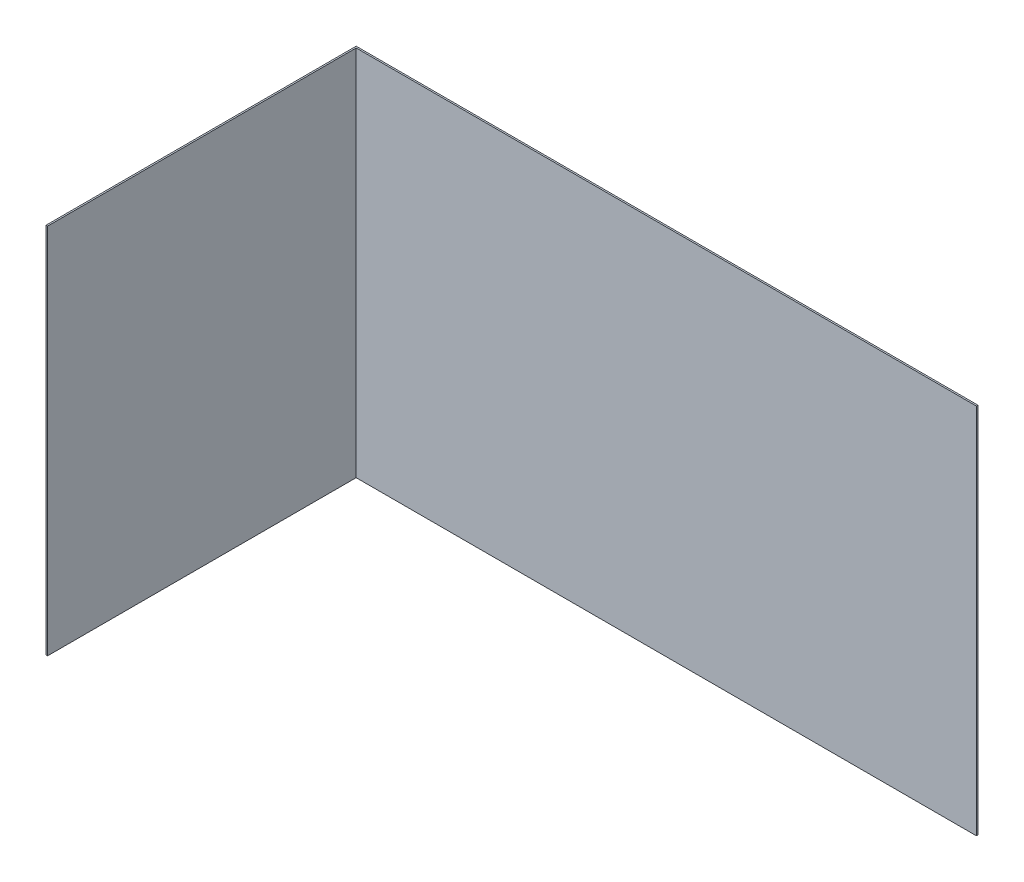
ISO-10303-21;
HEADER;
FILE_DESCRIPTION(('STEP AP214'),'2;1');
FILE_NAME('part.step','',(''),(''),'','','');
FILE_SCHEMA(('AUTOMOTIVE_DESIGN { 1 0 10303 214 1 1 1 1 }'));
ENDSEC;
DATA;
#1=APPLICATION_CONTEXT('core data for automotive mechanical design processes');
#2=APPLICATION_PROTOCOL_DEFINITION('international standard','automotive_design',2000,#1);
#3=PRODUCT_CONTEXT('',#1,'mechanical');
#4=PRODUCT('Part','Part','',(#3));
#5=PRODUCT_RELATED_PRODUCT_CATEGORY('part','',(#4));
#6=PRODUCT_DEFINITION_FORMATION('','',#4);
#7=PRODUCT_DEFINITION_CONTEXT('part definition',#1,'design');
#8=PRODUCT_DEFINITION('design','',#6,#7);
#9=PRODUCT_DEFINITION_SHAPE('','',#8);
#10=(LENGTH_UNIT() NAMED_UNIT(*) SI_UNIT(.MILLI.,.METRE.));
#11=(NAMED_UNIT(*) PLANE_ANGLE_UNIT() SI_UNIT($,.RADIAN.));
#12=(NAMED_UNIT(*) SI_UNIT($,.STERADIAN.) SOLID_ANGLE_UNIT());
#13=UNCERTAINTY_MEASURE_WITH_UNIT(LENGTH_MEASURE(1.E-05),#10,'distance_accuracy_value','');
#14=(GEOMETRIC_REPRESENTATION_CONTEXT(3) GLOBAL_UNCERTAINTY_ASSIGNED_CONTEXT((#13)) GLOBAL_UNIT_ASSIGNED_CONTEXT((#10,
#11,#12)) REPRESENTATION_CONTEXT('',''));
#15=CARTESIAN_POINT('',(0.,0.,0.));
#16=DIRECTION('',(0.,0.,1.));
#17=DIRECTION('',(1.,0.,0.));
#18=AXIS2_PLACEMENT_3D('',#15,#16,#17);
#19=CARTESIAN_POINT('',(0.,0.,0.2));
#20=DIRECTION('',(0.,0.,-1.));
#21=DIRECTION('',(-1.,0.,0.));
#22=AXIS2_PLACEMENT_3D('',#19,#20,#21);
#23=PLANE('',#22);
#24=DIRECTION('',(-1.,0.,0.));
#25=VECTOR('',#24,1.);
#26=CARTESIAN_POINT('',(0.,0.24,0.2));
#27=LINE('',#26,#25);
#28=CARTESIAN_POINT('',(0.,0.24,0.2));
#29=VERTEX_POINT('',#28);
#30=CARTESIAN_POINT('',(-0.00100000000000002,0.24,0.2));
#31=VERTEX_POINT('',#30);
#32=EDGE_CURVE('E88',#29,#31,#27,.T.);
#33=ORIENTED_EDGE('',*,*,#32,.T.);
#34=DIRECTION('',(0.,1.,0.));
#35=VECTOR('',#34,1.);
#36=CARTESIAN_POINT('',(-0.00100000000000004,0.,0.2));
#37=LINE('',#36,#35);
#38=CARTESIAN_POINT('',(-0.00100000000000004,0.,0.2));
#39=VERTEX_POINT('',#38);
#40=EDGE_CURVE('E72',#31,#39,#37,.F.);
#41=ORIENTED_EDGE('',*,*,#40,.T.);
#42=DIRECTION('',(-1.,0.,0.));
#43=VECTOR('',#42,1.);
#44=CARTESIAN_POINT('',(0.,0.,0.2));
#45=LINE('',#44,#43);
#46=CARTESIAN_POINT('',(0.,0.,0.2));
#47=VERTEX_POINT('',#46);
#48=EDGE_CURVE('E20',#39,#47,#45,.F.);
#49=ORIENTED_EDGE('',*,*,#48,.T.);
#50=DIRECTION('',(0.,1.,0.));
#51=VECTOR('',#50,1.);
#52=CARTESIAN_POINT('',(0.,0.,0.2));
#53=LINE('',#52,#51);
#54=EDGE_CURVE('E77',#29,#47,#53,.F.);
#55=ORIENTED_EDGE('',*,*,#54,.F.);
#56=EDGE_LOOP('',(#33,#41,#49,#55));
#57=FACE_BOUND('',#56,.T.);
#58=ADVANCED_FACE('F17',(#57),#23,.F.);
#59=CARTESIAN_POINT('',(0.,0.,0.));
#60=DIRECTION('',(1.,0.,0.));
#61=DIRECTION('',(0.,0.,-1.));
#62=AXIS2_PLACEMENT_3D('',#59,#60,#61);
#63=PLANE('',#62);
#64=DIRECTION('',(0.,0.,-1.));
#65=VECTOR('',#64,1.);
#66=CARTESIAN_POINT('',(0.,0.24,0.));
#67=LINE('',#66,#65);
#68=CARTESIAN_POINT('',(0.,0.24,0.000999999999999999));
#69=VERTEX_POINT('',#68);
#70=EDGE_CURVE('E111',#69,#29,#67,.F.);
#71=ORIENTED_EDGE('',*,*,#70,.T.);
#72=ORIENTED_EDGE('',*,*,#54,.T.);
#73=DIRECTION('',(0.,0.,-1.));
#74=VECTOR('',#73,1.);
#75=CARTESIAN_POINT('',(0.,0.,0.));
#76=LINE('',#75,#74);
#77=CARTESIAN_POINT('',(0.,0.,0.001));
#78=VERTEX_POINT('',#77);
#79=EDGE_CURVE('E83',#47,#78,#76,.T.);
#80=ORIENTED_EDGE('',*,*,#79,.T.);
#81=DIRECTION('',(0.,1.,0.));
#82=VECTOR('',#81,1.);
#83=CARTESIAN_POINT('',(0.,0.,0.001));
#84=LINE('',#83,#82);
#85=EDGE_CURVE('E100',#78,#69,#84,.T.);
#86=ORIENTED_EDGE('',*,*,#85,.T.);
#87=EDGE_LOOP('',(#71,#72,#80,#86));
#88=FACE_BOUND('',#87,.T.);
#89=ADVANCED_FACE('F112',(#88),#63,.T.);
#90=CARTESIAN_POINT('',(-0.001,0.24,0.));
#91=DIRECTION('',(1.,0.,0.));
#92=DIRECTION('',(0.,0.,-1.));
#93=AXIS2_PLACEMENT_3D('',#90,#91,#92);
#94=PLANE('',#93);
#95=DIRECTION('',(0.,0.,1.));
#96=VECTOR('',#95,1.);
#97=CARTESIAN_POINT('',(-0.001,0.,0.));
#98=LINE('',#97,#96);
#99=CARTESIAN_POINT('',(-0.001,0.,0.));
#100=VERTEX_POINT('',#99);
#101=EDGE_CURVE('E67',#39,#100,#98,.F.);
#102=ORIENTED_EDGE('',*,*,#101,.F.);
#103=ORIENTED_EDGE('',*,*,#40,.F.);
#104=DIRECTION('',(0.,0.,-1.));
#105=VECTOR('',#104,1.);
#106=CARTESIAN_POINT('',(-0.001,0.24,0.));
#107=LINE('',#106,#105);
#108=CARTESIAN_POINT('',(-0.001,0.24,0.));
#109=VERTEX_POINT('',#108);
#110=EDGE_CURVE('E76',#31,#109,#107,.T.);
#111=ORIENTED_EDGE('',*,*,#110,.T.);
#112=DIRECTION('',(0.,1.,0.));
#113=VECTOR('',#112,1.);
#114=CARTESIAN_POINT('',(-0.001,0.,0.));
#115=LINE('',#114,#113);
#116=EDGE_CURVE('E74',#100,#109,#115,.T.);
#117=ORIENTED_EDGE('',*,*,#116,.F.);
#118=EDGE_LOOP('',(#102,#103,#111,#117));
#119=FACE_BOUND('',#118,.T.);
#120=ADVANCED_FACE('F69',(#119),#94,.F.);
#121=CARTESIAN_POINT('',(-0.001,0.,0.001));
#122=DIRECTION('',(0.,0.,-1.));
#123=DIRECTION('',(-1.,0.,0.));
#124=AXIS2_PLACEMENT_3D('',#121,#122,#123);
#125=PLANE('',#124);
#126=DIRECTION('',(1.,0.,0.));
#127=VECTOR('',#126,1.);
#128=CARTESIAN_POINT('',(0.4,0.24,0.001));
#129=LINE('',#128,#127);
#130=CARTESIAN_POINT('',(0.4,0.24,0.001));
#131=VERTEX_POINT('',#130);
#132=EDGE_CURVE('E99',#131,#69,#129,.F.);
#133=ORIENTED_EDGE('',*,*,#132,.T.);
#134=ORIENTED_EDGE('',*,*,#85,.F.);
#135=DIRECTION('',(1.,0.,0.));
#136=VECTOR('',#135,1.);
#137=CARTESIAN_POINT('',(-0.001,0.,0.001));
#138=LINE('',#137,#136);
#139=CARTESIAN_POINT('',(0.4,0.,0.001));
#140=VERTEX_POINT('',#139);
#141=EDGE_CURVE('E102',#78,#140,#138,.T.);
#142=ORIENTED_EDGE('',*,*,#141,.T.);
#143=DIRECTION('',(0.,1.,0.));
#144=VECTOR('',#143,1.);
#145=CARTESIAN_POINT('',(0.4,0.,0.001));
#146=LINE('',#145,#144);
#147=EDGE_CURVE('E95',#140,#131,#146,.T.);
#148=ORIENTED_EDGE('',*,*,#147,.T.);
#149=EDGE_LOOP('',(#133,#134,#142,#148));
#150=FACE_BOUND('',#149,.T.);
#151=ADVANCED_FACE('F114',(#150),#125,.F.);
#152=CARTESIAN_POINT('',(-0.001,0.,0.));
#153=DIRECTION('',(0.,1.,0.));
#154=DIRECTION('',(0.,0.,1.));
#155=AXIS2_PLACEMENT_3D('',#152,#153,#154);
#156=PLANE('',#155);
#157=ORIENTED_EDGE('',*,*,#141,.F.);
#158=ORIENTED_EDGE('',*,*,#79,.F.);
#159=ORIENTED_EDGE('',*,*,#48,.F.);
#160=ORIENTED_EDGE('',*,*,#101,.T.);
#161=DIRECTION('',(-1.,0.,0.));
#162=VECTOR('',#161,1.);
#163=CARTESIAN_POINT('',(-0.001,0.,0.));
#164=LINE('',#163,#162);
#165=CARTESIAN_POINT('',(0.4,0.,0.));
#166=VERTEX_POINT('',#165);
#167=EDGE_CURVE('E94',#166,#100,#164,.T.);
#168=ORIENTED_EDGE('',*,*,#167,.F.);
#169=DIRECTION('',(0.,0.,1.));
#170=VECTOR('',#169,1.);
#171=CARTESIAN_POINT('',(0.4,0.,0.));
#172=LINE('',#171,#170);
#173=EDGE_CURVE('E96',#166,#140,#172,.T.);
#174=ORIENTED_EDGE('',*,*,#173,.T.);
#175=EDGE_LOOP('',(#157,#158,#159,#160,#168,#174));
#176=FACE_BOUND('',#175,.T.);
#177=ADVANCED_FACE('F82',(#176),#156,.F.);
#178=CARTESIAN_POINT('',(0.4,0.24,0.));
#179=DIRECTION('',(0.,-1.,0.));
#180=DIRECTION('',(0.,0.,-1.));
#181=AXIS2_PLACEMENT_3D('',#178,#179,#180);
#182=PLANE('',#181);
#183=ORIENTED_EDGE('',*,*,#132,.F.);
#184=DIRECTION('',(0.,0.,-1.));
#185=VECTOR('',#184,1.);
#186=CARTESIAN_POINT('',(0.4,0.24,0.));
#187=LINE('',#186,#185);
#188=CARTESIAN_POINT('',(0.4,0.24,0.));
#189=VERTEX_POINT('',#188);
#190=EDGE_CURVE('E35',#131,#189,#187,.T.);
#191=ORIENTED_EDGE('',*,*,#190,.T.);
#192=DIRECTION('',(-1.,0.,0.));
#193=VECTOR('',#192,1.);
#194=CARTESIAN_POINT('',(-0.001,0.24,0.));
#195=LINE('',#194,#193);
#196=EDGE_CURVE('E26',#109,#189,#195,.F.);
#197=ORIENTED_EDGE('',*,*,#196,.F.);
#198=ORIENTED_EDGE('',*,*,#110,.F.);
#199=ORIENTED_EDGE('',*,*,#32,.F.);
#200=ORIENTED_EDGE('',*,*,#70,.F.);
#201=EDGE_LOOP('',(#183,#191,#197,#198,#199,#200));
#202=FACE_BOUND('',#201,.T.);
#203=ADVANCED_FACE('F127',(#202),#182,.F.);
#204=CARTESIAN_POINT('',(0.4,0.,0.));
#205=DIRECTION('',(-1.,0.,0.));
#206=DIRECTION('',(0.,0.,1.));
#207=AXIS2_PLACEMENT_3D('',#204,#205,#206);
#208=PLANE('',#207);
#209=ORIENTED_EDGE('',*,*,#190,.F.);
#210=ORIENTED_EDGE('',*,*,#147,.F.);
#211=ORIENTED_EDGE('',*,*,#173,.F.);
#212=DIRECTION('',(0.,1.,0.));
#213=VECTOR('',#212,1.);
#214=CARTESIAN_POINT('',(0.4,0.,0.));
#215=LINE('',#214,#213);
#216=EDGE_CURVE('E11',#189,#166,#215,.F.);
#217=ORIENTED_EDGE('',*,*,#216,.F.);
#218=EDGE_LOOP('',(#209,#210,#211,#217));
#219=FACE_BOUND('',#218,.T.);
#220=ADVANCED_FACE('F119',(#219),#208,.F.);
#221=CARTESIAN_POINT('',(-0.001,0.,0.));
#222=DIRECTION('',(0.,0.,-1.));
#223=DIRECTION('',(-1.,0.,0.));
#224=AXIS2_PLACEMENT_3D('',#221,#222,#223);
#225=PLANE('',#224);
#226=ORIENTED_EDGE('',*,*,#196,.T.);
#227=ORIENTED_EDGE('',*,*,#216,.T.);
#228=ORIENTED_EDGE('',*,*,#167,.T.);
#229=ORIENTED_EDGE('',*,*,#116,.T.);
#230=EDGE_LOOP('',(#226,#227,#228,#229));
#231=FACE_BOUND('',#230,.T.);
#232=ADVANCED_FACE('F126',(#231),#225,.T.);
#233=CLOSED_SHELL('',(#58,#89,#120,#151,#177,#203,#220,#232));
#234=MANIFOLD_SOLID_BREP('B1',#233);
#235=ADVANCED_BREP_SHAPE_REPRESENTATION('',(#18,#234),#14);
#236=SHAPE_DEFINITION_REPRESENTATION(#9,#235);
ENDSEC;
END-ISO-10303-21;
